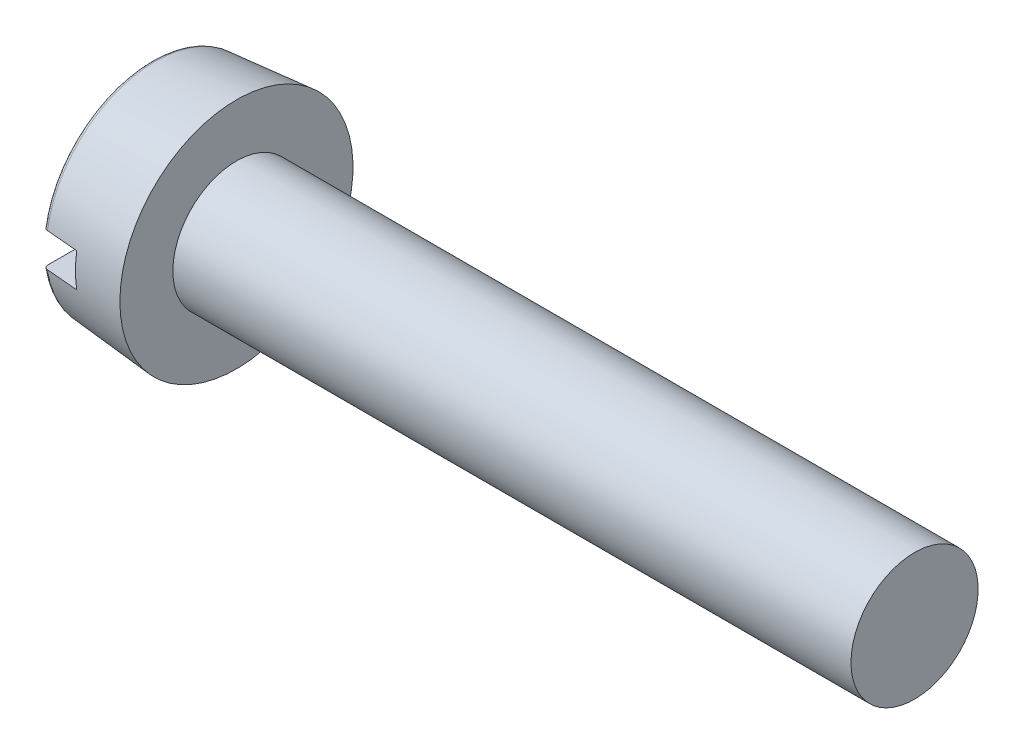
ISO-10303-21;
HEADER;
FILE_DESCRIPTION(('STEP AP214'),'2;1');
FILE_NAME('part.step','',(''),(''),'','','');
FILE_SCHEMA(('AUTOMOTIVE_DESIGN { 1 0 10303 214 1 1 1 1 }'));
ENDSEC;
DATA;
#1=APPLICATION_CONTEXT('core data for automotive mechanical design processes');
#2=APPLICATION_PROTOCOL_DEFINITION('international standard','automotive_design',2000,#1);
#3=PRODUCT_CONTEXT('',#1,'mechanical');
#4=PRODUCT('Part','Part','',(#3));
#5=PRODUCT_RELATED_PRODUCT_CATEGORY('part','',(#4));
#6=PRODUCT_DEFINITION_FORMATION('','',#4);
#7=PRODUCT_DEFINITION_CONTEXT('part definition',#1,'design');
#8=PRODUCT_DEFINITION('design','',#6,#7);
#9=PRODUCT_DEFINITION_SHAPE('','',#8);
#10=(LENGTH_UNIT() NAMED_UNIT(*) SI_UNIT(.MILLI.,.METRE.));
#11=(NAMED_UNIT(*) PLANE_ANGLE_UNIT() SI_UNIT($,.RADIAN.));
#12=(NAMED_UNIT(*) SI_UNIT($,.STERADIAN.) SOLID_ANGLE_UNIT());
#13=UNCERTAINTY_MEASURE_WITH_UNIT(LENGTH_MEASURE(1.E-05),#10,'distance_accuracy_value','');
#14=(GEOMETRIC_REPRESENTATION_CONTEXT(3) GLOBAL_UNCERTAINTY_ASSIGNED_CONTEXT((#13)) GLOBAL_UNIT_ASSIGNED_CONTEXT((#10,
#11,#12)) REPRESENTATION_CONTEXT('',''));
#15=CARTESIAN_POINT('',(0.,0.,0.));
#16=DIRECTION('',(0.,0.,1.));
#17=DIRECTION('',(1.,0.,0.));
#18=AXIS2_PLACEMENT_3D('',#15,#16,#17);
#19=CARTESIAN_POINT('',(0.,0.,0.));
#20=DIRECTION('',(-1.,0.,0.));
#21=DIRECTION('',(0.,0.,1.));
#22=AXIS2_PLACEMENT_3D('',#19,#20,#21);
#23=PLANE('',#22);
#24=DIRECTION('',(0.,0.,-1.));
#25=VECTOR('',#24,1.);
#26=CARTESIAN_POINT('',(0.,0.4,2.75));
#27=LINE('',#26,#25);
#28=CARTESIAN_POINT('',(0.,0.4,2.45096382768024));
#29=VERTEX_POINT('',#28);
#30=CARTESIAN_POINT('',(0.,0.4,-2.45096382768024));
#31=VERTEX_POINT('',#30);
#32=EDGE_CURVE('E105',#29,#31,#27,.T.);
#33=ORIENTED_EDGE('',*,*,#32,.F.);
#34=CARTESIAN_POINT('',(0.,0.,0.));
#35=DIRECTION('',(-1.,0.,0.));
#36=DIRECTION('',(0.,0.,1.));
#37=AXIS2_PLACEMENT_3D('',#34,#35,#36);
#38=CIRCLE('',#37,2.48338955554641);
#39=EDGE_CURVE('E107',#29,#31,#38,.T.);
#40=ORIENTED_EDGE('',*,*,#39,.T.);
#41=EDGE_LOOP('',(#33,#40));
#42=FACE_BOUND('',#41,.T.);
#43=ADVANCED_FACE('F36',(#42),#23,.T.);
#44=CARTESIAN_POINT('',(0.1,0.,0.));
#45=DIRECTION('',(-1.,0.,0.));
#46=DIRECTION('',(0.,0.,1.));
#47=AXIS2_PLACEMENT_3D('',#44,#45,#46);
#48=TOROIDAL_SURFACE('',#47,2.48338955554641,0.1);
#49=CARTESIAN_POINT('',(0.0289938380211761,0.4,-2.52228316549766));
#50=CARTESIAN_POINT('',(0.0329146400399011,0.4,-2.52628601737879));
#51=CARTESIAN_POINT('',(0.0371732059087863,0.4,-2.52996330795833));
#52=CARTESIAN_POINT('',(0.046249437484113,0.4,-2.53655558833691));
#53=CARTESIAN_POINT('',(0.0510676904570532,0.4,-2.53946976679746));
#54=CARTESIAN_POINT('',(0.0611266188974548,0.4,-2.54444525866304));
#55=CARTESIAN_POINT('',(0.0663672780390158,0.4,-2.54650660501096));
#56=CARTESIAN_POINT('',(0.0771205298537044,0.4,-2.5497128714041));
#57=CARTESIAN_POINT('',(0.0826330564249985,0.4,-2.55085801306043));
#58=CARTESIAN_POINT('',(0.0937360108304335,0.4,-2.5521931808089));
#59=CARTESIAN_POINT('',(0.0993256947509515,0.4,-2.55238939597481));
#60=CARTESIAN_POINT('',(0.110458306622039,0.4,-2.55183747650024));
#61=CARTESIAN_POINT('',(0.116001234198318,0.4,-2.55108933430726));
#62=CARTESIAN_POINT('',(0.126865819783631,0.4,-2.54867516285271));
#63=CARTESIAN_POINT('',(0.132188090847036,0.4,-2.54701188972793));
#64=CARTESIAN_POINT('',(0.142479668135715,0.4,-2.54281935144472));
#65=CARTESIAN_POINT('',(0.147448970444546,0.4,-2.54029007667919));
#66=CARTESIAN_POINT('',(0.156919019556884,0.4,-2.53442699567865));
#67=CARTESIAN_POINT('',(0.161417530686885,0.4,-2.53108957986598));
#68=CARTESIAN_POINT('',(0.16979758331873,0.4,-2.52371398467403));
#69=CARTESIAN_POINT('',(0.173679096427556,0.4,-2.51967577306341));
#70=CARTESIAN_POINT('',(0.180758379631839,0.4,-2.51096934806693));
#71=CARTESIAN_POINT('',(0.183948691710374,0.4,-2.50629507144611));
#72=CARTESIAN_POINT('',(0.189510239570672,0.4,-2.49648236653712));
#73=CARTESIAN_POINT('',(0.191881421883503,0.4,-2.49134390797694));
#74=CARTESIAN_POINT('',(0.195767027940457,0.4,-2.48068220520699));
#75=CARTESIAN_POINT('',(0.197270760971853,0.4,-2.47515506403468));
#76=CARTESIAN_POINT('',(0.199338128353477,0.4,-2.4639276342002));
#77=CARTESIAN_POINT('',(0.199901709526225,0.4,-2.45822733576238));
#78=CARTESIAN_POINT('',(0.20007548133907,0.4,-2.44676112412241));
#79=CARTESIAN_POINT('',(0.199677113345941,0.4,-2.44099507954687));
#80=CARTESIAN_POINT('',(0.197919889661746,0.4,-2.42961109138142));
#81=CARTESIAN_POINT('',(0.196561010768147,0.4,-2.42399315137259));
#82=CARTESIAN_POINT('',(0.192915627153958,0.4,-2.41305590565846));
#83=CARTESIAN_POINT('',(0.190627555523932,0.4,-2.40773712175833));
#84=CARTESIAN_POINT('',(0.185185000915827,0.4,-2.39756279520368));
#85=CARTESIAN_POINT('',(0.182030540035585,0.4,-2.39270724073845));
#86=CARTESIAN_POINT('',(0.174965864483063,0.4,-2.38363467595376));
#87=CARTESIAN_POINT('',(0.171060998294419,0.4,-2.37941350258364));
#88=CARTESIAN_POINT('',(0.162589830789106,0.4,-2.37169707517616));
#89=CARTESIAN_POINT('',(0.158023574903145,0.4,-2.36820177131908));
#90=CARTESIAN_POINT('',(0.14842159607908,0.4,-2.36208459946197));
#91=CARTESIAN_POINT('',(0.143392636404649,0.4,-2.35945211619945));
#92=CARTESIAN_POINT('',(0.132960042691406,0.4,-2.35508144798975));
#93=CARTESIAN_POINT('',(0.127556438263747,0.4,-2.35334319245586));
#94=CARTESIAN_POINT('',(0.116602502745338,0.4,-2.35083201602087));
#95=CARTESIAN_POINT('',(0.111054942498253,0.4,-2.35004699968965));
#96=CARTESIAN_POINT('',(0.0999070705254333,0.4,-2.3494263065429));
#97=CARTESIAN_POINT('',(0.0943067613611995,0.4,-2.34959058386431));
#98=CARTESIAN_POINT('',(0.0832511443149565,0.4,-2.35085902950956));
#99=CARTESIAN_POINT('',(0.0777951256899424,0.4,-2.3519570180145));
#100=CARTESIAN_POINT('',(0.0671440893672213,0.4,-2.35505088710293));
#101=CARTESIAN_POINT('',(0.0619490721184737,0.4,-2.35704676923085));
#102=CARTESIAN_POINT('',(0.0519500535749678,0.4,-2.36188301447907));
#103=CARTESIAN_POINT('',(0.0471472182076562,0.4,-2.36472578664258));
#104=CARTESIAN_POINT('',(0.0380802947550963,0.4,-2.37116917771983));
#105=CARTESIAN_POINT('',(0.0338162339656359,0.4,-2.37476983500548));
#106=CARTESIAN_POINT('',(0.0258978392798655,0.4,-2.38266730942151));
#107=CARTESIAN_POINT('',(0.0222505790304374,0.4,-2.38697121737475));
#108=CARTESIAN_POINT('',(0.0157188388685996,0.4,-2.39612333377568));
#109=CARTESIAN_POINT('',(0.0128344147286455,0.4,-2.40097158198427));
#110=CARTESIAN_POINT('',(0.00786953684593835,0.4,-2.41114518595604));
#111=CARTESIAN_POINT('',(0.00580049504437294,0.4,-2.41647611188959));
#112=CARTESIAN_POINT('',(0.00257668282239859,0.4,-2.4274074136993));
#113=CARTESIAN_POINT('',(0.00142193421228844,0.4,-2.43300779599991));
#114=CARTESIAN_POINT('',(4.9830908244966E-05,0.4,-2.44437919860998));
#115=CARTESIAN_POINT('',(-0.000158040154989086,0.4,-2.45015136490808));
#116=CARTESIAN_POINT('',(0.000395629680353913,0.4,-2.46165070249477));
#117=CARTESIAN_POINT('',(0.00115743264880528,0.4,-2.46737786119837));
#118=CARTESIAN_POINT('',(0.00363465605126324,0.4,-2.47863907342415));
#119=CARTESIAN_POINT('',(0.00535281370350042,0.4,-2.48417252398631));
#120=CARTESIAN_POINT('',(0.00969850669250382,0.4,-2.49486489969062));
#121=CARTESIAN_POINT('',(0.0123249394519188,0.4,-2.50002426979425));
#122=CARTESIAN_POINT('',(0.0173136943959975,0.4,-2.50805181152184));
#123=CARTESIAN_POINT('',(0.0194300826406195,0.4,-2.51107561025655));
#124=CARTESIAN_POINT('',(0.0239801784125791,0.4,-2.51687431501129));
#125=CARTESIAN_POINT('',(0.0264138847052191,0.4,-2.5196492219997));
#126=CARTESIAN_POINT('',(0.0289938380211761,0.4,-2.52228316549766));
#127=B_SPLINE_CURVE_WITH_KNOTS('',3,(#49,#50,#51,#52,#53,#54,#55,#56,#57,#58,#59,#60,#61,#62,
#63,#64,#65,#66,#67,#68,#69,#70,#71,#72,#73,#74,#75,#76,#77,#78,#79,#80,#81,#82,#83,#84,#85,#86,
#87,#88,#89,#90,#91,#92,#93,#94,#95,#96,#97,#98,#99,#100,#101,#102,#103,#104,#105,#106,#107,
#108,#109,#110,#111,#112,#113,#114,#115,#116,#117,#118,#119,#120,#121,#122,#123,#124,#125,#126),
.UNSPECIFIED.,.T.,.F.,(4,2,2,2,2,2,2,2,2,2,2,2,2,2,2,2,2,2,2,2,2,2,2,2,2,2,2,2,2,2,2,2,2,2,2,2,
2,2,4),(0.,0.0167962438770801,0.0336102736228913,0.0504236538216826,0.0672329659785202,
0.0839324954656504,0.100632158508099,0.11728179964717,0.133931625497132,0.150657236214899,
0.167383616389183,0.184282358747595,0.201182203967944,0.218286107817178,0.235390979075726,
0.252648595290838,0.269906628402956,0.287193885606232,0.304480701927406,0.321648593971804,
0.33881530731633,0.355762112546912,0.372707579860326,0.389435704571817,0.406163021107,
0.422780481006366,0.439397969489148,0.456063186523276,0.472729247524451,0.489575093862968,
0.506422171494332,0.523497308438318,0.540572852694337,0.557819049576411,0.575069908508114,
0.592370397548949,0.609649958399181,0.620702210843322,0.631754420283978),.UNSPECIFIED.);
#128=CARTESIAN_POINT('',(0.0912844257252299,0.4,-2.5518494518816));
#129=VERTEX_POINT('',#128);
#130=EDGE_CURVE('E60',#31,#129,#127,.T.);
#131=ORIENTED_EDGE('',*,*,#130,.F.);
#132=ORIENTED_EDGE('',*,*,#39,.F.);
#133=CARTESIAN_POINT('',(0.036767698702164,0.4,2.37243473528728));
#134=CARTESIAN_POINT('',(0.0410691072562516,0.4,2.36887462682049));
#135=CARTESIAN_POINT('',(0.0456712476146377,0.4,2.36567202074306));
#136=CARTESIAN_POINT('',(0.0553504912178819,0.4,2.36008032650183));
#137=CARTESIAN_POINT('',(0.0604280839551128,0.4,2.35769208875703));
#138=CARTESIAN_POINT('',(0.0709135886904192,0.4,2.35380489827384));
#139=CARTESIAN_POINT('',(0.0763214938192326,0.4,2.35230592704897));
#140=CARTESIAN_POINT('',(0.0873116719417475,0.4,2.35024450872371));
#141=CARTESIAN_POINT('',(0.0928939027986412,0.4,2.34968183706536));
#142=CARTESIAN_POINT('',(0.104036601297581,0.4,2.34951039508072));
#143=CARTESIAN_POINT('',(0.109596974662458,0.4,2.34989545024077));
#144=CARTESIAN_POINT('',(0.120573920357346,0.4,2.35159460899385));
#145=CARTESIAN_POINT('',(0.125990490202903,0.4,2.35290872862724));
#146=CARTESIAN_POINT('',(0.13652239124753,0.4,2.35642416504567));
#147=CARTESIAN_POINT('',(0.141637967615105,0.4,2.35862474798458));
#148=CARTESIAN_POINT('',(0.151431222534293,0.4,2.3638467445852));
#149=CARTESIAN_POINT('',(0.156108887376012,0.4,2.36686818393429));
#150=CARTESIAN_POINT('',(0.164936002938917,0.4,2.37367095440966));
#151=CARTESIAN_POINT('',(0.16908079389346,0.4,2.3774583297866));
#152=CARTESIAN_POINT('',(0.176685910750912,0.4,2.38566704388047));
#153=CARTESIAN_POINT('',(0.180146192360979,0.4,2.39008842359027));
#154=CARTESIAN_POINT('',(0.186332746435633,0.4,2.39950205527751));
#155=CARTESIAN_POINT('',(0.189048713902264,0.4,2.40450107962601));
#156=CARTESIAN_POINT('',(0.193614409893133,0.4,2.41488017557624));
#157=CARTESIAN_POINT('',(0.195464077650945,0.4,2.42026027387786));
#158=CARTESIAN_POINT('',(0.19826623133481,0.4,2.43131856240102));
#159=CARTESIAN_POINT('',(0.199207620171234,0.4,2.43699956654937));
#160=CARTESIAN_POINT('',(0.20012925691986,0.4,2.4484391128062));
#161=CARTESIAN_POINT('',(0.200109464431673,0.4,2.45419765816372));
#162=CARTESIAN_POINT('',(0.199105792419158,0.4,2.46566309979117));
#163=CARTESIAN_POINT('',(0.198116473192368,0.4,2.47136952123461));
#164=CARTESIAN_POINT('',(0.195191128966346,0.4,2.48253449565388));
#165=CARTESIAN_POINT('',(0.193255106776879,0.4,2.48799304936533));
#166=CARTESIAN_POINT('',(0.188494675278442,0.4,2.49848893070217));
#167=CARTESIAN_POINT('',(0.185672880951563,0.4,2.50352744366315));
#168=CARTESIAN_POINT('',(0.17921549855744,0.4,2.51305299197626));
#169=CARTESIAN_POINT('',(0.175579948629359,0.4,2.51754005315861));
#170=CARTESIAN_POINT('',(0.167635478825505,0.4,2.52578731588122));
#171=CARTESIAN_POINT('',(0.163333512373971,0.4,2.5295542142048));
#172=CARTESIAN_POINT('',(0.154151555490121,0.4,2.53630156216166));
#173=CARTESIAN_POINT('',(0.149271604711318,0.4,2.53928206570155));
#174=CARTESIAN_POINT('',(0.13913635307135,0.4,2.54433379308572));
#175=CARTESIAN_POINT('',(0.133886369113007,0.4,2.54641568563766));
#176=CARTESIAN_POINT('',(0.123109394747461,0.4,2.54965893225548));
#177=CARTESIAN_POINT('',(0.117582421034199,0.4,2.55082034172732));
#178=CARTESIAN_POINT('',(0.106464698916146,0.4,2.55218028189334));
#179=CARTESIAN_POINT('',(0.100875054594367,0.4,2.55238785185234));
#180=CARTESIAN_POINT('',(0.0897407847209888,0.4,2.55185843737951));
#181=CARTESIAN_POINT('',(0.0841961579348969,0.4,2.55112147893765));
#182=CARTESIAN_POINT('',(0.0733265657266895,0.4,2.54872918263962));
#183=CARTESIAN_POINT('',(0.0680009847337701,0.4,2.54707663871121));
#184=CARTESIAN_POINT('',(0.0577010526378303,0.4,2.54290481605141));
#185=CARTESIAN_POINT('',(0.0527267057044031,0.4,2.54038552703274));
#186=CARTESIAN_POINT('',(0.043245195515422,0.4,2.53454156724994));
#187=CARTESIAN_POINT('',(0.0387402389480661,0.4,2.53121331773258));
#188=CARTESIAN_POINT('',(0.0303458654217715,0.4,2.52385482922165));
#189=CARTESIAN_POINT('',(0.026456478694282,0.4,2.51982455577117));
#190=CARTESIAN_POINT('',(0.0193602742266985,0.4,2.51113277232454));
#191=CARTESIAN_POINT('',(0.0161608831052452,0.4,2.50646520000313));
#192=CARTESIAN_POINT('',(0.0105801862776839,0.4,2.49666430232761));
#193=CARTESIAN_POINT('',(0.0081989347764835,0.4,2.491530946142));
#194=CARTESIAN_POINT('',(0.004292300079086,0.4,2.48087765570879));
#195=CARTESIAN_POINT('',(0.00277761888662459,0.4,2.47535379620009));
#196=CARTESIAN_POINT('',(0.000687995440567138,0.4,2.46413127035624));
#197=CARTESIAN_POINT('',(0.000113070892212485,0.4,2.45843260072968));
#198=CARTESIAN_POINT('',(-8.37002456026316E-05,0.4,2.44696818040157));
#199=CARTESIAN_POINT('',(0.000302941335767531,0.4,2.44120228266164));
#200=CARTESIAN_POINT('',(0.00203701001733569,0.4,2.42981508207598));
#201=CARTESIAN_POINT('',(0.0033846949475402,0.4,2.42419381845226));
#202=CARTESIAN_POINT('',(0.00700896577894943,0.4,2.41324562761761));
#203=CARTESIAN_POINT('',(0.0092876051572296,0.4,2.40791938083122));
#204=CARTESIAN_POINT('',(0.0147114792186618,0.4,2.39773348978099));
#205=CARTESIAN_POINT('',(0.0178556585516149,0.4,2.39287328693997));
#206=CARTESIAN_POINT('',(0.023650362660492,0.4,2.38539954815907));
#207=CARTESIAN_POINT('',(0.0260726096208587,0.4,2.38260604033144));
#208=CARTESIAN_POINT('',(0.0312086078085587,0.4,2.37730112356));
#209=CARTESIAN_POINT('',(0.0339223576900253,0.4,2.37478971331387));
#210=CARTESIAN_POINT('',(0.036767698702164,0.4,2.37243473528728));
#211=B_SPLINE_CURVE_WITH_KNOTS('',3,(#133,#134,#135,#136,#137,#138,#139,#140,#141,#142,#143,
#144,#145,#146,#147,#148,#149,#150,#151,#152,#153,#154,#155,#156,#157,#158,#159,#160,#161,#162,
#163,#164,#165,#166,#167,#168,#169,#170,#171,#172,#173,#174,#175,#176,#177,#178,#179,#180,#181,
#182,#183,#184,#185,#186,#187,#188,#189,#190,#191,#192,#193,#194,#195,#196,#197,#198,#199,#200,
#201,#202,#203,#204,#205,#206,#207,#208,#209,#210),.UNSPECIFIED.,.T.,.F.,(4,2,2,2,2,2,2,2,2,2,2,
2,2,2,2,2,2,2,2,2,2,2,2,2,2,2,2,2,2,2,2,2,2,2,2,2,2,2,4),(0.,0.0167374978406356,
0.0334924209723802,0.0502469957829487,0.0669975516708023,0.0836392656129616,0.100281266882441,
0.116909519525703,0.133538292583203,0.150303803185788,0.167070398286947,0.18405857971598,
0.201047952599288,0.218242362613188,0.235437495343469,0.252729660021828,0.270021773378246,
0.287263309496307,0.304504037705845,0.321575685446243,0.338646162637365,0.35550798995053,
0.372368802234774,0.389069495340301,0.405769728913956,0.422419279849293,0.439069028402679,
0.455793818907913,0.472519430535029,0.489416954805598,0.506315598386582,0.523418666684378,
0.540522057204382,0.55777696190307,0.575036497513281,0.592334311120995,0.609611126268918,
0.62068287365548,0.631754569926062),.UNSPECIFIED.);
#212=CARTESIAN_POINT('',(0.0912844257243783,0.4,2.55184945188522));
#213=VERTEX_POINT('',#212);
#214=EDGE_CURVE('E97',#213,#29,#211,.T.);
#215=ORIENTED_EDGE('',*,*,#214,.F.);
#216=CARTESIAN_POINT('',(0.0912844257252299,0.,0.));
#217=DIRECTION('',(-1.,0.,0.));
#218=DIRECTION('',(0.,0.,1.));
#219=AXIS2_PLACEMENT_3D('',#216,#217,#218);
#220=CIRCLE('',#219,2.58300902535558);
#221=EDGE_CURVE('E111',#129,#213,#220,.F.);
#222=ORIENTED_EDGE('',*,*,#221,.F.);
#223=EDGE_LOOP('',(#131,#132,#215,#222));
#224=FACE_BOUND('',#223,.T.);
#225=ADVANCED_FACE('F188',(#224),#48,.T.);
#226=CARTESIAN_POINT('',(-25.4,0.,0.));
#227=DIRECTION('',(-1.,0.,0.));
#228=DIRECTION('',(0.,0.,1.));
#229=AXIS2_PLACEMENT_3D('',#226,#227,#228);
#230=CYLINDRICAL_SURFACE('',#229,1.5);
#231=CARTESIAN_POINT('',(18.,0.,0.));
#232=DIRECTION('',(-1.,0.,0.));
#233=DIRECTION('',(0.,0.,1.));
#234=AXIS2_PLACEMENT_3D('',#231,#232,#233);
#235=CIRCLE('',#234,1.5);
#236=CARTESIAN_POINT('',(18.,0.,1.5));
#237=VERTEX_POINT('',#236);
#238=EDGE_CURVE('E108',#237,#237,#235,.T.);
#239=ORIENTED_EDGE('',*,*,#238,.T.);
#240=EDGE_LOOP('',(#239));
#241=FACE_BOUND('',#240,.T.);
#242=CARTESIAN_POINT('',(2.,0.,0.));
#243=DIRECTION('',(-1.,0.,0.));
#244=DIRECTION('',(0.,0.,1.));
#245=AXIS2_PLACEMENT_3D('',#242,#243,#244);
#246=CIRCLE('',#245,1.5);
#247=CARTESIAN_POINT('',(2.,0.,1.5));
#248=VERTEX_POINT('',#247);
#249=EDGE_CURVE('E175',#248,#248,#246,.T.);
#250=ORIENTED_EDGE('',*,*,#249,.F.);
#251=EDGE_LOOP('',(#250));
#252=FACE_BOUND('',#251,.T.);
#253=ADVANCED_FACE('F185',(#241,#252),#230,.T.);
#254=CARTESIAN_POINT('',(18.,1.5,0.));
#255=DIRECTION('',(1.,0.,0.));
#256=DIRECTION('',(0.,0.,-1.));
#257=AXIS2_PLACEMENT_3D('',#254,#255,#256);
#258=PLANE('',#257);
#259=ORIENTED_EDGE('',*,*,#238,.F.);
#260=EDGE_LOOP('',(#259));
#261=FACE_BOUND('',#260,.T.);
#262=ADVANCED_FACE('F187',(#261),#258,.T.);
#263=DIRECTION('',(0.,0.,1.));
#264=VECTOR('',#263,1.);
#265=CARTESIAN_POINT('',(0.,-0.4,-2.75));
#266=LINE('',#265,#264);
#267=CARTESIAN_POINT('',(0.,-0.4,-2.45096382768024));
#268=VERTEX_POINT('',#267);
#269=CARTESIAN_POINT('',(0.,-0.4,2.45096382768024));
#270=VERTEX_POINT('',#269);
#271=EDGE_CURVE('E52',#268,#270,#266,.T.);
#272=ORIENTED_EDGE('',*,*,#271,.F.);
#273=EDGE_CURVE('E103',#268,#270,#38,.T.);
#274=ORIENTED_EDGE('',*,*,#273,.T.);
#275=EDGE_LOOP('',(#272,#274));
#276=FACE_BOUND('',#275,.T.);
#277=ADVANCED_FACE('F102',(#276),#23,.T.);
#278=CARTESIAN_POINT('',(0.,0.,0.));
#279=DIRECTION('',(1.,0.,0.));
#280=DIRECTION('',(0.,0.,-1.));
#281=AXIS2_PLACEMENT_3D('',#278,#279,#280);
#282=CONICAL_SURFACE('',#281,2.57502267294815,0.0872664625997168);
#283=CARTESIAN_POINT('',(-4.36225986914577,0.4,-2.15659249784001));
#284=CARTESIAN_POINT('',(-3.02252879329931,0.4,-2.27578971400984));
#285=CARTESIAN_POINT('',(-1.68277158070833,0.4,-2.3946924855258));
#286=CARTESIAN_POINT('',(-0.0871929715729562,0.4,-2.53604555798389));
#287=CARTESIAN_POINT('',(0.168610376643266,0.4,-2.55869953286896));
#288=CARTESIAN_POINT('',(2.02000114161502,0.4,-2.72260692865391));
#289=CARTESIAN_POINT('',(3.61561248830951,0.4,-2.86359016848939));
#290=CARTESIAN_POINT('',(5.21123588736543,0.4,-3.00443640584799));
#291=B_SPLINE_CURVE_WITH_KNOTS('',3,(#283,#284,#285,#286,#287,#288,#289,#290),.UNSPECIFIED.,.F.,
.F.,(4,2,2,4),(0.,4.03506939923898,4.80548292410974,9.61096578658457),.UNSPECIFIED.);
#292=CARTESIAN_POINT('',(0.85,0.4,-2.61901832187334));
#293=VERTEX_POINT('',#292);
#294=EDGE_CURVE('E169',#129,#293,#291,.T.);
#295=ORIENTED_EDGE('',*,*,#294,.F.);
#296=ORIENTED_EDGE('',*,*,#221,.T.);
#297=CARTESIAN_POINT('',(5.21123588736543,0.4,3.00443640584799));
#298=CARTESIAN_POINT('',(4.41342358696222,0.4,2.93401988873196));
#299=CARTESIAN_POINT('',(3.61561486907633,0.4,2.86356274948076));
#300=CARTESIAN_POINT('',(2.02000692465129,0.4,2.72254136292326));
#301=CARTESIAN_POINT('',(1.22220769811185,0.4,2.65197711562021));
#302=CARTESIAN_POINT('',(-0.373378996688641,0.4,2.51071564393346));
#303=CARTESIAN_POINT('',(-1.17116646494953,0.4,2.44001841954794));
#304=CARTESIAN_POINT('',(-2.76672581923324,0.4,2.29844809218199));
#305=CARTESIAN_POINT('',(-3.56449770525557,0.4,2.22757498919617));
#306=CARTESIAN_POINT('',(-4.36225986914577,0.4,2.15659249784001));
#307=B_SPLINE_CURVE_WITH_KNOTS('',3,(#297,#298,#299,#300,#301,#302,#303,#304,#305,#306),
.UNSPECIFIED.,.F.,.F.,(4,2,2,2,4),(0.,2.40274147318214,4.80548287330204,7.20822430613116,
9.61096581263779),.UNSPECIFIED.);
#308=CARTESIAN_POINT('',(0.85,0.4,2.61901832187334));
#309=VERTEX_POINT('',#308);
#310=EDGE_CURVE('E164',#309,#213,#307,.T.);
#311=ORIENTED_EDGE('',*,*,#310,.F.);
#312=CARTESIAN_POINT('',(0.85,0.,0.));
#313=DIRECTION('',(-1.,0.,0.));
#314=DIRECTION('',(0.,0.,1.));
#315=AXIS2_PLACEMENT_3D('',#312,#313,#314);
#316=CIRCLE('',#315,2.64938803694519);
#317=CARTESIAN_POINT('',(0.85,-0.4,2.61901832187334));
#318=VERTEX_POINT('',#317);
#319=EDGE_CURVE('E41',#309,#318,#316,.F.);
#320=ORIENTED_EDGE('',*,*,#319,.T.);
#321=CARTESIAN_POINT('',(-4.36225986914577,-0.4,2.15659249784001));
#322=CARTESIAN_POINT('',(-3.02252879329931,-0.4,2.27578971400984));
#323=CARTESIAN_POINT('',(-1.68277158070833,-0.4,2.3946924855258));
#324=CARTESIAN_POINT('',(-0.0871929715729562,-0.4,2.53604555798389));
#325=CARTESIAN_POINT('',(0.168610376643266,-0.4,2.55869953286896));
#326=CARTESIAN_POINT('',(2.02000114161502,-0.400000000000001,2.72260692865391));
#327=CARTESIAN_POINT('',(3.61561248830951,-0.400000000000001,2.86359016848939));
#328=CARTESIAN_POINT('',(5.21123588736543,-0.4,3.00443640584799));
#329=B_SPLINE_CURVE_WITH_KNOTS('',3,(#321,#322,#323,#324,#325,#326,#327,#328),.UNSPECIFIED.,.F.,
.F.,(4,2,2,4),(0.,4.03506939923898,4.80548292410974,9.61096578658457),.UNSPECIFIED.);
#330=CARTESIAN_POINT('',(0.0912844257241088,-0.4,2.55184945188157));
#331=VERTEX_POINT('',#330);
#332=EDGE_CURVE('E140',#331,#318,#329,.T.);
#333=ORIENTED_EDGE('',*,*,#332,.F.);
#334=CARTESIAN_POINT('',(0.0912844257452029,-0.4,-2.55184945199817));
#335=VERTEX_POINT('',#334);
#336=EDGE_CURVE('E117',#331,#335,#220,.F.);
#337=ORIENTED_EDGE('',*,*,#336,.T.);
#338=CARTESIAN_POINT('',(5.21123588736543,-0.4,-3.00443640584799));
#339=CARTESIAN_POINT('',(4.41342358696222,-0.4,-2.93401988873196));
#340=CARTESIAN_POINT('',(3.61561486907633,-0.4,-2.86356274948076));
#341=CARTESIAN_POINT('',(2.02000692465129,-0.4,-2.72254136292326));
#342=CARTESIAN_POINT('',(1.22220769811185,-0.4,-2.65197711562021));
#343=CARTESIAN_POINT('',(-0.373378996688641,-0.4,-2.51071564393346));
#344=CARTESIAN_POINT('',(-1.17116646494953,-0.4,-2.44001841954794));
#345=CARTESIAN_POINT('',(-2.76672581923324,-0.4,-2.29844809218199));
#346=CARTESIAN_POINT('',(-3.56449770525557,-0.4,-2.22757498919617));
#347=CARTESIAN_POINT('',(-4.36225986914577,-0.4,-2.15659249784001));
#348=B_SPLINE_CURVE_WITH_KNOTS('',3,(#338,#339,#340,#341,#342,#343,#344,#345,#346,#347),
.UNSPECIFIED.,.F.,.F.,(4,2,2,2,4),(0.,2.40274147318214,4.80548287330204,7.20822430613116,
9.61096581263779),.UNSPECIFIED.);
#349=CARTESIAN_POINT('',(0.85,-0.4,-2.61901832187334));
#350=VERTEX_POINT('',#349);
#351=EDGE_CURVE('E92',#350,#335,#348,.T.);
#352=ORIENTED_EDGE('',*,*,#351,.F.);
#353=EDGE_CURVE('E11',#350,#293,#316,.F.);
#354=ORIENTED_EDGE('',*,*,#353,.T.);
#355=EDGE_LOOP('',(#295,#296,#311,#320,#333,#337,#352,#354));
#356=FACE_BOUND('',#355,.T.);
#357=CARTESIAN_POINT('',(2.,0.,0.));
#358=DIRECTION('',(-1.,0.,0.));
#359=DIRECTION('',(0.,0.,1.));
#360=AXIS2_PLACEMENT_3D('',#357,#358,#359);
#361=CIRCLE('',#360,2.75);
#362=CARTESIAN_POINT('',(2.,0.,2.75));
#363=VERTEX_POINT('',#362);
#364=EDGE_CURVE('E113',#363,#363,#361,.T.);
#365=ORIENTED_EDGE('',*,*,#364,.T.);
#366=EDGE_LOOP('',(#365));
#367=FACE_BOUND('',#366,.T.);
#368=ADVANCED_FACE('F153',(#356,#367),#282,.T.);
#369=CARTESIAN_POINT('',(2.,1.5,0.));
#370=DIRECTION('',(-1.,0.,0.));
#371=DIRECTION('',(0.,0.,1.));
#372=AXIS2_PLACEMENT_3D('',#369,#370,#371);
#373=PLANE('',#372);
#374=ORIENTED_EDGE('',*,*,#364,.F.);
#375=EDGE_LOOP('',(#374));
#376=FACE_BOUND('',#375,.T.);
#377=ORIENTED_EDGE('',*,*,#249,.T.);
#378=EDGE_LOOP('',(#377));
#379=FACE_BOUND('',#378,.T.);
#380=ADVANCED_FACE('F157',(#376,#379),#373,.F.);
#381=CARTESIAN_POINT('',(0.0289938380211761,-0.4,-2.52228316549766));
#382=CARTESIAN_POINT('',(0.0250040691259323,-0.4,-2.51820918183003));
#383=CARTESIAN_POINT('',(0.0213583190112084,-0.4,-2.51379201367196));
#384=CARTESIAN_POINT('',(0.0148592785644251,-0.4,-2.50440306026762));
#385=CARTESIAN_POINT('',(0.0120070700796538,-0.4,-2.49943053069828));
#386=CARTESIAN_POINT('',(0.00717770347925436,-0.4,-2.48908271582266));
#387=CARTESIAN_POINT('',(0.00519971746694655,-0.4,-2.48370781723002));
#388=CARTESIAN_POINT('',(0.00216717495668321,-0.4,-2.47270542437941));
#389=CARTESIAN_POINT('',(0.00111238322136101,-0.4,-2.4670779948528));
#390=CARTESIAN_POINT('',(-5.25582059453468E-05,-0.4,-2.45568286085502));
#391=CARTESIAN_POINT('',(-0.000155467825421282,-0.4,-2.44991441534212));
#392=CARTESIAN_POINT('',(0.0006044999590182,-0.4,-2.43844109806142));
#393=CARTESIAN_POINT('',(0.00146745336414954,-0.4,-2.43273623133216));
#394=CARTESIAN_POINT('',(0.00414151157260951,-0.4,-2.42152987250593));
#395=CARTESIAN_POINT('',(0.00595623339048462,-0.4,-2.41602924255959));
#396=CARTESIAN_POINT('',(0.0104876390060404,-0.4,-2.40541275972393));
#397=CARTESIAN_POINT('',(0.0132043100000633,-0.4,-2.40029690137383));
#398=CARTESIAN_POINT('',(0.0194512493609963,-0.4,-2.39062289289038));
#399=CARTESIAN_POINT('',(0.0229775960031606,-0.4,-2.38606221159139));
#400=CARTESIAN_POINT('',(0.0307542280705713,-0.4,-2.37760643337986));
#401=CARTESIAN_POINT('',(0.0350044686960859,-0.4,-2.37371129530861));
#402=CARTESIAN_POINT('',(0.0440555019555723,-0.4,-2.3667470396541));
#403=CARTESIAN_POINT('',(0.0488492409468844,-0.4,-2.36366875652182));
#404=CARTESIAN_POINT('',(0.0588909820215914,-0.4,-2.3583735233016));
#405=CARTESIAN_POINT('',(0.0641389481441083,-0.4,-2.35615650510399));
#406=CARTESIAN_POINT('',(0.0748640783279196,-0.4,-2.35267719664892));
#407=CARTESIAN_POINT('',(0.0803372009928299,-0.4,-2.35140244386473));
#408=CARTESIAN_POINT('',(0.0914202264447997,-0.4,-2.34979886854022));
#409=CARTESIAN_POINT('',(0.0970301209943445,-0.4,-2.34946998917295));
#410=CARTESIAN_POINT('',(0.108175670502414,-0.4,-2.34976708273981));
#411=CARTESIAN_POINT('',(0.113711547505791,-0.4,-2.35038480500947));
#412=CARTESIAN_POINT('',(0.124600906547845,-0.4,-2.35254069219937));
#413=CARTESIAN_POINT('',(0.129954390579146,-0.4,-2.35407884706056));
#414=CARTESIAN_POINT('',(0.140330562478326,-0.4,-2.35802931008484));
#415=CARTESIAN_POINT('',(0.145353122327479,-0.4,-2.36044195422667));
#416=CARTESIAN_POINT('',(0.1549268792096,-0.4,-2.36606888937863));
#417=CARTESIAN_POINT('',(0.159478058010393,-0.4,-2.36928321137984));
#418=CARTESIAN_POINT('',(0.168025501299987,-0.4,-2.37645214423981));
#419=CARTESIAN_POINT('',(0.172016319852358,-0.4,-2.38041324620994));
#420=CARTESIAN_POINT('',(0.179287042308478,-0.4,-2.3889414041015));
#421=CARTESIAN_POINT('',(0.182566897622746,-0.4,-2.3935085014042));
#422=CARTESIAN_POINT('',(0.188369159015882,-0.4,-2.40318459258693));
#423=CARTESIAN_POINT('',(0.190880811711647,-0.4,-2.40830003507254));
#424=CARTESIAN_POINT('',(0.195020891957927,-0.4,-2.41887665144677));
#425=CARTESIAN_POINT('',(0.196649260076486,-0.4,-2.42433784857194));
#426=CARTESIAN_POINT('',(0.198994072160015,-0.4,-2.43551846416643));
#427=CARTESIAN_POINT('',(0.199699802934894,-0.4,-2.44124013143329));
#428=CARTESIAN_POINT('',(0.200145599532922,-0.4,-2.45272108096227));
#429=CARTESIAN_POINT('',(0.199885628830452,-0.4,-2.45848036463892));
#430=CARTESIAN_POINT('',(0.19840271623648,-0.4,-2.46990089334109));
#431=CARTESIAN_POINT('',(0.197175332540678,-0.4,-2.47556156274737));
#432=CARTESIAN_POINT('',(0.193783964811841,-0.4,-2.48659519893132));
#433=CARTESIAN_POINT('',(0.191619990295665,-0.4,-2.49196816863173));
#434=CARTESIAN_POINT('',(0.186423491809559,-0.4,-2.5022498657427));
#435=CARTESIAN_POINT('',(0.183394426113028,-0.4,-2.50716034009667));
#436=CARTESIAN_POINT('',(0.176546746863081,-0.4,-2.51639609907409));
#437=CARTESIAN_POINT('',(0.17272817212622,-0.4,-2.52072141244993));
#438=CARTESIAN_POINT('',(0.164451603414078,-0.4,-2.52861521808819));
#439=CARTESIAN_POINT('',(0.160000663078315,-0.4,-2.5321911048007));
#440=CARTESIAN_POINT('',(0.150555440028442,-0.4,-2.53853392400498));
#441=CARTESIAN_POINT('',(0.145561193801722,-0.4,-2.54130091077495));
#442=CARTESIAN_POINT('',(0.1352363695906,-0.4,-2.54591243640717));
#443=CARTESIAN_POINT('',(0.129910608025946,-0.4,-2.54776776094683));
#444=CARTESIAN_POINT('',(0.119021928101674,-0.4,-2.55054885934361));
#445=CARTESIAN_POINT('',(0.113459032918953,-0.4,-2.55147472382786));
#446=CARTESIAN_POINT('',(0.102307195571538,-0.4,-2.55236453620601));
#447=CARTESIAN_POINT('',(0.0967189330552622,-0.4,-2.55233702605628));
#448=CARTESIAN_POINT('',(0.0856253047271044,-0.4,-2.55134185745125));
#449=CARTESIAN_POINT('',(0.0801199583532395,-0.4,-2.55037398192563));
#450=CARTESIAN_POINT('',(0.069359393169626,-0.4,-2.54752998768229));
#451=CARTESIAN_POINT('',(0.06410378470178,-0.4,-2.54565533854207));
#452=CARTESIAN_POINT('',(0.0539843368990682,-0.4,-2.54105571590675));
#453=CARTESIAN_POINT('',(0.0491200334774587,-0.4,-2.53833176895425));
#454=CARTESIAN_POINT('',(0.0417210877997122,-0.4,-2.53333714733838));
#455=CARTESIAN_POINT('',(0.0390206414531833,-0.4,-2.53130731123891));
#456=CARTESIAN_POINT('',(0.0338378944269698,-0.4,-2.5269861226631));
#457=CARTESIAN_POINT('',(0.0313555927448635,-0.4,-2.5246947713886));
#458=CARTESIAN_POINT('',(0.0289938380211761,-0.4,-2.52228316549766));
#459=B_SPLINE_CURVE_WITH_KNOTS('',3,(#381,#382,#383,#384,#385,#386,#387,#388,#389,#390,#391,
#392,#393,#394,#395,#396,#397,#398,#399,#400,#401,#402,#403,#404,#405,#406,#407,#408,#409,#410,
#411,#412,#413,#414,#415,#416,#417,#418,#419,#420,#421,#422,#423,#424,#425,#426,#427,#428,#429,
#430,#431,#432,#433,#434,#435,#436,#437,#438,#439,#440,#441,#442,#443,#444,#445,#446,#447,#448,
#449,#450,#451,#452,#453,#454,#455,#456,#457,#458),.UNSPECIFIED.,.T.,.F.,(4,2,2,2,2,2,2,2,2,2,2,
2,2,2,2,2,2,2,2,2,2,2,2,2,2,2,2,2,2,2,2,2,2,2,2,2,2,2,4),(0.,0.0170942392389229,
0.0342116703729637,0.0513128562267132,0.0684096832903604,0.0856364438942344,0.102864560121804,
0.120158628073268,0.137452450536553,0.154664213002627,0.171874910668653,0.18888343932403,
0.20589062265436,0.222668631829328,0.239445632980397,0.256077233802163,0.27270865286704,
0.289346468507189,0.305984927428096,0.322775300606075,0.339566820929858,0.356583638258373,
0.37360160042444,0.390815461144305,0.408029972948722,0.425323987595625,0.442617826519228,
0.459843477026109,0.47706828082769,0.494114170430573,0.511158915969807,0.527996838794442,
0.544833119675484,0.561518591762549,0.578207916374967,0.594870283327568,0.611512588116958,
0.621631616777721,0.631750598936938),.UNSPECIFIED.);
#460=EDGE_CURVE('E88',#335,#268,#459,.T.);
#461=ORIENTED_EDGE('',*,*,#460,.F.);
#462=ORIENTED_EDGE('',*,*,#336,.F.);
#463=CARTESIAN_POINT('',(0.036767698702164,-0.4,2.37243473528728));
#464=CARTESIAN_POINT('',(0.0323825993918221,-0.4,2.376064766641));
#465=CARTESIAN_POINT('',(0.0283037127586665,-0.4,2.38007177408389));
#466=CARTESIAN_POINT('',(0.0208754097236727,-0.4,2.38871904036558));
#467=CARTESIAN_POINT('',(0.0175270033246336,-0.4,2.3933601617357));
#468=CARTESIAN_POINT('',(0.0116570776320304,-0.4,2.40313270602566));
#469=CARTESIAN_POINT('',(0.00913472821970495,-0.4,2.40826362999444));
#470=CARTESIAN_POINT('',(0.00497968232768619,-0.4,2.41887190213891));
#471=CARTESIAN_POINT('',(0.00334675788140122,-0.4,2.42434916114416));
#472=CARTESIAN_POINT('',(0.0010016966854105,-0.4,2.43554641737224));
#473=CARTESIAN_POINT('',(0.00029755521299045,-0.4,2.44126809010381));
#474=CARTESIAN_POINT('',(-0.000145121663011624,-0.4,2.45274905375029));
#475=CARTESIAN_POINT('',(0.000116421789298055,-0.4,2.45850834769892));
#476=CARTESIAN_POINT('',(0.00160247308833705,-0.4,2.46992855294402));
#477=CARTESIAN_POINT('',(0.00283141045044878,-0.4,2.47558888896036));
#478=CARTESIAN_POINT('',(0.00622581243878602,-0.4,2.486621594425));
#479=CARTESIAN_POINT('',(0.008391266628206,-0.4,2.49199396708169));
#480=CARTESIAN_POINT('',(0.0135905931181137,-0.4,2.50227420499959));
#481=CARTESIAN_POINT('',(0.0166210040147391,-0.4,2.50718381998701));
#482=CARTESIAN_POINT('',(0.0234711987479806,-0.4,2.51641762191268));
#483=CARTESIAN_POINT('',(0.0272909405744303,-0.4,2.52074183998697));
#484=CARTESIAN_POINT('',(0.0355696248224728,-0.4,2.52863327794772));
#485=CARTESIAN_POINT('',(0.0400215149384832,-0.4,2.53220789499491));
#486=CARTESIAN_POINT('',(0.0494684030939924,-0.4,2.53854802988593));
#487=CARTESIAN_POINT('',(0.0544633641997854,-0.4,2.54131360270489));
#488=CARTESIAN_POINT('',(0.0647892630327103,-0.4,2.54592217430933));
#489=CARTESIAN_POINT('',(0.0701153800428128,-0.4,2.54777597641343));
#490=CARTESIAN_POINT('',(0.0810047128387974,-0.4,2.55055407863819));
#491=CARTESIAN_POINT('',(0.0865679149637753,-0.4,2.55147843223863));
#492=CARTESIAN_POINT('',(0.0977207563531533,-0.4,2.55236521435313));
#493=CARTESIAN_POINT('',(0.103309726295532,-0.4,2.55233608070093));
#494=CARTESIAN_POINT('',(0.114402937889977,-0.4,2.55133769001562));
#495=CARTESIAN_POINT('',(0.119907181471709,-0.4,2.55036845442587));
#496=CARTESIAN_POINT('',(0.130663236148904,-0.4,2.54752235629068));
#497=CARTESIAN_POINT('',(0.135915551335542,-0.4,2.54564739710644));
#498=CARTESIAN_POINT('',(0.146033240425047,-0.4,2.54104687692431));
#499=CARTESIAN_POINT('',(0.150898607454475,-0.4,2.53832130082098));
#500=CARTESIAN_POINT('',(0.160133532834313,-0.4,2.53208305631211));
#501=CARTESIAN_POINT('',(0.164500283568366,-0.4,2.5285662331518));
#502=CARTESIAN_POINT('',(0.172589200308648,-0.4,2.520856498684));
#503=CARTESIAN_POINT('',(0.176311333654103,-0.4,2.51666355314026));
#504=CARTESIAN_POINT('',(0.183048642136847,-0.4,2.50767286712186));
#505=CARTESIAN_POINT('',(0.186055783056341,-0.4,2.50286910685156));
#506=CARTESIAN_POINT('',(0.191231971525039,-0.4,2.49282955053378));
#507=CARTESIAN_POINT('',(0.193400964848264,-0.4,2.48759372655947));
#508=CARTESIAN_POINT('',(0.196865823745477,-0.4,2.47677152916927));
#509=CARTESIAN_POINT('',(0.198150936463139,-0.4,2.4711817121246));
#510=CARTESIAN_POINT('',(0.199773012529528,-0.4,2.4598661010716));
#511=CARTESIAN_POINT('',(0.200109924006275,-0.4,2.45414029964144));
#512=CARTESIAN_POINT('',(0.199826178778735,-0.4,2.44266501865172));
#513=CARTESIAN_POINT('',(0.199197601251489,-0.4,2.43691573330961));
#514=CARTESIAN_POINT('',(0.196985004298198,-0.4,2.42560388351766));
#515=CARTESIAN_POINT('',(0.195400968047121,-0.4,2.42004132235772));
#516=CARTESIAN_POINT('',(0.19131807855711,-0.4,2.40925817069416));
#517=CARTESIAN_POINT('',(0.188818610794393,-0.4,2.40403781269138));
#518=CARTESIAN_POINT('',(0.182972137296714,-0.4,2.39409522397092));
#519=CARTESIAN_POINT('',(0.179625156644996,-0.4,2.38937297851681));
#520=CARTESIAN_POINT('',(0.172204734064941,-0.4,2.38060178429019));
#521=CARTESIAN_POINT('',(0.168137165616085,-0.4,2.37654786844744));
#522=CARTESIAN_POINT('',(0.159371199251644,-0.4,2.36919152820334));
#523=CARTESIAN_POINT('',(0.154672845537622,-0.4,2.36588905118943));
#524=CARTESIAN_POINT('',(0.144844694580825,-0.4,2.36017590811791));
#525=CARTESIAN_POINT('',(0.139721379552863,-0.4,2.3577540912126));
#526=CARTESIAN_POINT('',(0.129137638954462,-0.4,2.35381742239515));
#527=CARTESIAN_POINT('',(0.123677253113316,-0.4,2.35230246381927));
#528=CARTESIAN_POINT('',(0.112647488636252,-0.4,2.35024006877604));
#529=CARTESIAN_POINT('',(0.107080321826037,-0.4,2.34968078927394));
#530=CARTESIAN_POINT('',(0.095930066818771,-0.4,2.34951053477204));
#531=CARTESIAN_POINT('',(0.0903469755001888,-0.4,2.34989976058669));
#532=CARTESIAN_POINT('',(0.0793550427648693,-0.4,2.35161001176195));
#533=CARTESIAN_POINT('',(0.0739454647455398,-0.4,2.35292632935928));
#534=CARTESIAN_POINT('',(0.0634276574620605,-0.4,2.35644465047497));
#535=CARTESIAN_POINT('',(0.0583190694664363,-0.4,2.35864557415748));
#536=CARTESIAN_POINT('',(0.0504757118332205,-0.4,2.36283119494618));
#537=CARTESIAN_POINT('',(0.0476002394747204,-0.4,2.3645580049642));
#538=CARTESIAN_POINT('',(0.0420370347664568,-0.4,2.36829123725297));
#539=CARTESIAN_POINT('',(0.0393493011403997,-0.4,2.37029765762258));
#540=CARTESIAN_POINT('',(0.036767698702164,-0.4,2.37243473528728));
#541=B_SPLINE_CURVE_WITH_KNOTS('',3,(#463,#464,#465,#466,#467,#468,#469,#470,#471,#472,#473,
#474,#475,#476,#477,#478,#479,#480,#481,#482,#483,#484,#485,#486,#487,#488,#489,#490,#491,#492,
#493,#494,#495,#496,#497,#498,#499,#500,#501,#502,#503,#504,#505,#506,#507,#508,#509,#510,#511,
#512,#513,#514,#515,#516,#517,#518,#519,#520,#521,#522,#523,#524,#525,#526,#527,#528,#529,#530,
#531,#532,#533,#534,#535,#536,#537,#538,#539,#540),.UNSPECIFIED.,.T.,.F.,(4,2,2,2,2,2,2,2,2,2,2,
2,2,2,2,2,2,2,2,2,2,2,2,2,2,2,2,2,2,2,2,2,2,2,2,2,2,2,4),(0.,0.0170655093154274,
0.0341544668772576,0.0512261983790912,0.0682935522008255,0.0855068889550234,0.102721631346819,
0.120015658571063,0.137309493070795,0.154535068368668,0.171759727114351,0.188805453722697,
0.205850021792793,0.222687452432115,0.23952391420271,0.25621142324232,0.272898551655318,
0.289550763936974,0.30620327194923,0.322945350420544,0.33968827691332,0.356611280877622,
0.373535379533221,0.390661890265501,0.407789337896744,0.425058050594196,0.442327067391777,
0.45960769809034,0.476887817405971,0.494033075203877,0.511177132193701,0.52809585970861,
0.545012596869058,0.561718134648517,0.57842720957718,0.595052042079095,0.611656642038365,
0.621703543346072,0.631750376345849),.UNSPECIFIED.);
#542=EDGE_CURVE('E98',#270,#331,#541,.T.);
#543=ORIENTED_EDGE('',*,*,#542,.F.);
#544=ORIENTED_EDGE('',*,*,#273,.F.);
#545=EDGE_LOOP('',(#461,#462,#543,#544));
#546=FACE_BOUND('',#545,.T.);
#547=ADVANCED_FACE('F38',(#546),#48,.T.);
#548=CARTESIAN_POINT('',(0.85,0.4,2.75));
#549=DIRECTION('',(0.,1.,0.));
#550=DIRECTION('',(0.,0.,1.));
#551=AXIS2_PLACEMENT_3D('',#548,#549,#550);
#552=PLANE('',#551);
#553=ORIENTED_EDGE('',*,*,#294,.T.);
#554=DIRECTION('',(0.,0.,-1.));
#555=VECTOR('',#554,1.);
#556=CARTESIAN_POINT('',(0.85,0.4,2.75));
#557=LINE('',#556,#555);
#558=EDGE_CURVE('E104',#309,#293,#557,.T.);
#559=ORIENTED_EDGE('',*,*,#558,.F.);
#560=ORIENTED_EDGE('',*,*,#310,.T.);
#561=ORIENTED_EDGE('',*,*,#214,.T.);
#562=ORIENTED_EDGE('',*,*,#32,.T.);
#563=ORIENTED_EDGE('',*,*,#130,.T.);
#564=EDGE_LOOP('',(#553,#559,#560,#561,#562,#563));
#565=FACE_BOUND('',#564,.T.);
#566=ADVANCED_FACE('F132',(#565),#552,.F.);
#567=CARTESIAN_POINT('',(0.85,-0.4,-2.75));
#568=DIRECTION('',(0.,-1.,0.));
#569=DIRECTION('',(0.,0.,-1.));
#570=AXIS2_PLACEMENT_3D('',#567,#568,#569);
#571=PLANE('',#570);
#572=ORIENTED_EDGE('',*,*,#351,.T.);
#573=ORIENTED_EDGE('',*,*,#460,.T.);
#574=ORIENTED_EDGE('',*,*,#271,.T.);
#575=ORIENTED_EDGE('',*,*,#542,.T.);
#576=ORIENTED_EDGE('',*,*,#332,.T.);
#577=DIRECTION('',(0.,0.,1.));
#578=VECTOR('',#577,1.);
#579=CARTESIAN_POINT('',(0.85,-0.4,-2.75));
#580=LINE('',#579,#578);
#581=EDGE_CURVE('E146',#350,#318,#580,.T.);
#582=ORIENTED_EDGE('',*,*,#581,.F.);
#583=EDGE_LOOP('',(#572,#573,#574,#575,#576,#582));
#584=FACE_BOUND('',#583,.T.);
#585=ADVANCED_FACE('F89',(#584),#571,.F.);
#586=CARTESIAN_POINT('',(0.85,0.4,-2.75));
#587=DIRECTION('',(-1.,0.,0.));
#588=DIRECTION('',(0.,0.,1.));
#589=AXIS2_PLACEMENT_3D('',#586,#587,#588);
#590=PLANE('',#589);
#591=ORIENTED_EDGE('',*,*,#581,.T.);
#592=ORIENTED_EDGE('',*,*,#319,.F.);
#593=ORIENTED_EDGE('',*,*,#558,.T.);
#594=ORIENTED_EDGE('',*,*,#353,.F.);
#595=EDGE_LOOP('',(#591,#592,#593,#594));
#596=FACE_BOUND('',#595,.T.);
#597=ADVANCED_FACE('F131',(#596),#590,.T.);
#598=CLOSED_SHELL('',(#43,#225,#253,#262,#277,#368,#380,#547,#566,#585,#597));
#599=MANIFOLD_SOLID_BREP('B2',#598);
#600=ADVANCED_BREP_SHAPE_REPRESENTATION('',(#18,#599),#14);
#601=SHAPE_DEFINITION_REPRESENTATION(#9,#600);
ENDSEC;
END-ISO-10303-21;
